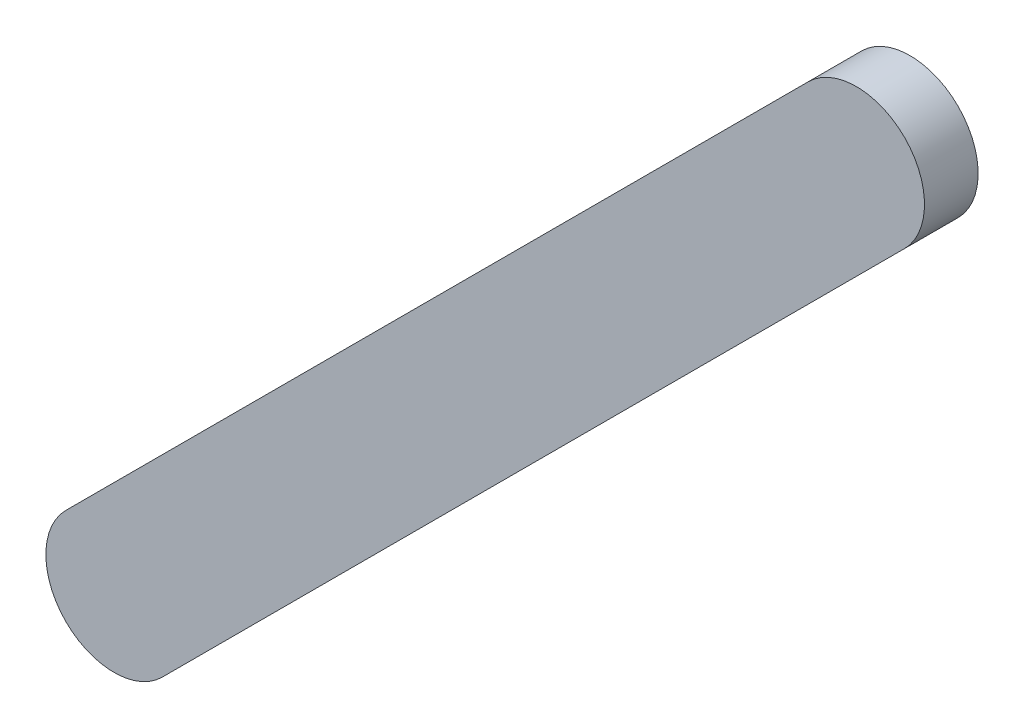
ISO-10303-21;
HEADER;
FILE_DESCRIPTION(('STEP AP214'),'2;1');
FILE_NAME('part.step','',(''),(''),'','','');
FILE_SCHEMA(('AUTOMOTIVE_DESIGN { 1 0 10303 214 1 1 1 1 }'));
ENDSEC;
DATA;
#1=APPLICATION_CONTEXT('core data for automotive mechanical design processes');
#2=APPLICATION_PROTOCOL_DEFINITION('international standard','automotive_design',2000,#1);
#3=PRODUCT_CONTEXT('',#1,'mechanical');
#4=PRODUCT('Part','Part','',(#3));
#5=PRODUCT_RELATED_PRODUCT_CATEGORY('part','',(#4));
#6=PRODUCT_DEFINITION_FORMATION('','',#4);
#7=PRODUCT_DEFINITION_CONTEXT('part definition',#1,'design');
#8=PRODUCT_DEFINITION('design','',#6,#7);
#9=PRODUCT_DEFINITION_SHAPE('','',#8);
#10=(LENGTH_UNIT() NAMED_UNIT(*) SI_UNIT(.MILLI.,.METRE.));
#11=(NAMED_UNIT(*) PLANE_ANGLE_UNIT() SI_UNIT($,.RADIAN.));
#12=(NAMED_UNIT(*) SI_UNIT($,.STERADIAN.) SOLID_ANGLE_UNIT());
#13=UNCERTAINTY_MEASURE_WITH_UNIT(LENGTH_MEASURE(1.E-05),#10,'distance_accuracy_value','');
#14=(GEOMETRIC_REPRESENTATION_CONTEXT(3) GLOBAL_UNCERTAINTY_ASSIGNED_CONTEXT((#13)) GLOBAL_UNIT_ASSIGNED_CONTEXT((#10,
#11,#12)) REPRESENTATION_CONTEXT('',''));
#15=CARTESIAN_POINT('',(0.,0.,0.));
#16=DIRECTION('',(0.,0.,1.));
#17=DIRECTION('',(1.,0.,0.));
#18=AXIS2_PLACEMENT_3D('',#15,#16,#17);
#19=CARTESIAN_POINT('',(133.65660594,119.8607966,0.));
#20=DIRECTION('',(-0.707106781186546,0.707106781186549,0.));
#21=DIRECTION('',(0.707106781186549,0.707106781186546,0.));
#22=AXIS2_PLACEMENT_3D('',#19,#20,#21);
#23=PLANE('',#22);
#24=DIRECTION('',(0.707106781186549,0.707106781186546,0.));
#25=VECTOR('',#24,1.);
#26=CARTESIAN_POINT('',(133.65660594,119.8607966,0.1999996));
#27=LINE('',#26,#25);
#28=CARTESIAN_POINT('',(133.65660594,119.8607966,0.1999996));
#29=VERTEX_POINT('',#28);
#30=CARTESIAN_POINT('',(136.4252034,122.62939406,0.1999996));
#31=VERTEX_POINT('',#30);
#32=EDGE_CURVE('E11',#29,#31,#27,.T.);
#33=ORIENTED_EDGE('',*,*,#32,.F.);
#34=DIRECTION('',(0.,0.,1.));
#35=VECTOR('',#34,1.);
#36=CARTESIAN_POINT('',(133.65660594,119.8607966,0.));
#37=LINE('',#36,#35);
#38=CARTESIAN_POINT('',(133.65660594,119.8607966,0.));
#39=VERTEX_POINT('',#38);
#40=EDGE_CURVE('E24',#39,#29,#37,.T.);
#41=ORIENTED_EDGE('',*,*,#40,.F.);
#42=DIRECTION('',(0.707106781186549,0.707106781186546,0.));
#43=VECTOR('',#42,1.);
#44=CARTESIAN_POINT('',(133.65660594,119.8607966,0.));
#45=LINE('',#44,#43);
#46=CARTESIAN_POINT('',(136.4252034,122.62939406,0.));
#47=VERTEX_POINT('',#46);
#48=EDGE_CURVE('E75',#39,#47,#45,.T.);
#49=ORIENTED_EDGE('',*,*,#48,.T.);
#50=DIRECTION('',(0.,0.,1.));
#51=VECTOR('',#50,1.);
#52=CARTESIAN_POINT('',(136.4252034,122.62939406,0.));
#53=LINE('',#52,#51);
#54=EDGE_CURVE('E37',#47,#31,#53,.T.);
#55=ORIENTED_EDGE('',*,*,#54,.T.);
#56=EDGE_LOOP('',(#33,#41,#49,#55));
#57=FACE_BOUND('',#56,.T.);
#58=ADVANCED_FACE('F17',(#57),#23,.F.);
#59=CARTESIAN_POINT('',(136.24559873,122.80899873,0.));
#60=DIRECTION('',(0.,0.,-1.));
#61=DIRECTION('',(0.707106781186548,-0.707106781186548,0.));
#62=AXIS2_PLACEMENT_3D('',#59,#60,#61);
#63=CYLINDRICAL_SURFACE('',#62,0.253999360179556);
#64=CARTESIAN_POINT('',(136.24559873,122.80899873,0.1999996));
#65=DIRECTION('',(0.,0.,1.));
#66=DIRECTION('',(0.707106781186548,-0.707106781186548,0.));
#67=AXIS2_PLACEMENT_3D('',#64,#65,#66);
#68=CIRCLE('',#67,0.253999360179556);
#69=CARTESIAN_POINT('',(136.06599406,122.9886034,0.1999996));
#70=VERTEX_POINT('',#69);
#71=EDGE_CURVE('E83',#31,#70,#68,.T.);
#72=ORIENTED_EDGE('',*,*,#71,.F.);
#73=ORIENTED_EDGE('',*,*,#54,.F.);
#74=CARTESIAN_POINT('',(136.24559873,122.80899873,0.));
#75=DIRECTION('',(0.,0.,1.));
#76=DIRECTION('',(0.707106781186548,-0.707106781186548,0.));
#77=AXIS2_PLACEMENT_3D('',#74,#75,#76);
#78=CIRCLE('',#77,0.253999360179556);
#79=CARTESIAN_POINT('',(136.06599406,122.9886034,0.));
#80=VERTEX_POINT('',#79);
#81=EDGE_CURVE('E81',#47,#80,#78,.T.);
#82=ORIENTED_EDGE('',*,*,#81,.T.);
#83=DIRECTION('',(0.,0.,1.));
#84=VECTOR('',#83,1.);
#85=CARTESIAN_POINT('',(136.06599406,122.9886034,0.));
#86=LINE('',#85,#84);
#87=EDGE_CURVE('E67',#80,#70,#86,.T.);
#88=ORIENTED_EDGE('',*,*,#87,.T.);
#89=EDGE_LOOP('',(#72,#73,#82,#88));
#90=FACE_BOUND('',#89,.T.);
#91=ADVANCED_FACE('F89',(#90),#63,.T.);
#92=CARTESIAN_POINT('',(136.06599406,122.9886034,0.));
#93=DIRECTION('',(0.707106781186553,-0.707106781186542,0.));
#94=DIRECTION('',(-0.707106781186542,-0.707106781186553,0.));
#95=AXIS2_PLACEMENT_3D('',#92,#93,#94);
#96=PLANE('',#95);
#97=DIRECTION('',(-0.707106781186542,-0.707106781186553,0.));
#98=VECTOR('',#97,1.);
#99=CARTESIAN_POINT('',(136.06599406,122.9886034,0.1999996));
#100=LINE('',#99,#98);
#101=CARTESIAN_POINT('',(133.2973966,120.22000594,0.1999996));
#102=VERTEX_POINT('',#101);
#103=EDGE_CURVE('E71',#70,#102,#100,.T.);
#104=ORIENTED_EDGE('',*,*,#103,.F.);
#105=ORIENTED_EDGE('',*,*,#87,.F.);
#106=DIRECTION('',(-0.707106781186542,-0.707106781186553,0.));
#107=VECTOR('',#106,1.);
#108=CARTESIAN_POINT('',(136.06599406,122.9886034,0.));
#109=LINE('',#108,#107);
#110=CARTESIAN_POINT('',(133.2973966,120.22000594,0.));
#111=VERTEX_POINT('',#110);
#112=EDGE_CURVE('E63',#80,#111,#109,.T.);
#113=ORIENTED_EDGE('',*,*,#112,.T.);
#114=DIRECTION('',(0.,0.,1.));
#115=VECTOR('',#114,1.);
#116=CARTESIAN_POINT('',(133.2973966,120.22000594,0.));
#117=LINE('',#116,#115);
#118=EDGE_CURVE('E53',#111,#102,#117,.T.);
#119=ORIENTED_EDGE('',*,*,#118,.T.);
#120=EDGE_LOOP('',(#104,#105,#113,#119));
#121=FACE_BOUND('',#120,.T.);
#122=ADVANCED_FACE('F66',(#121),#96,.F.);
#123=CARTESIAN_POINT('',(133.47700127,120.04040127,0.));
#124=DIRECTION('',(0.,0.,-1.));
#125=DIRECTION('',(-0.707106781186548,0.707106781186548,0.));
#126=AXIS2_PLACEMENT_3D('',#123,#124,#125);
#127=CYLINDRICAL_SURFACE('',#126,0.253999360179536);
#128=CARTESIAN_POINT('',(133.47700127,120.04040127,0.1999996));
#129=DIRECTION('',(0.,0.,1.));
#130=DIRECTION('',(-0.707106781186548,0.707106781186548,0.));
#131=AXIS2_PLACEMENT_3D('',#128,#129,#130);
#132=CIRCLE('',#131,0.253999360179536);
#133=EDGE_CURVE('E59',#102,#29,#132,.T.);
#134=ORIENTED_EDGE('',*,*,#133,.F.);
#135=ORIENTED_EDGE('',*,*,#118,.F.);
#136=CARTESIAN_POINT('',(133.47700127,120.04040127,0.));
#137=DIRECTION('',(0.,0.,1.));
#138=DIRECTION('',(-0.707106781186548,0.707106781186548,0.));
#139=AXIS2_PLACEMENT_3D('',#136,#137,#138);
#140=CIRCLE('',#139,0.253999360179536);
#141=EDGE_CURVE('E57',#111,#39,#140,.T.);
#142=ORIENTED_EDGE('',*,*,#141,.T.);
#143=ORIENTED_EDGE('',*,*,#40,.T.);
#144=EDGE_LOOP('',(#134,#135,#142,#143));
#145=FACE_BOUND('',#144,.T.);
#146=ADVANCED_FACE('F55',(#145),#127,.T.);
#147=CARTESIAN_POINT('',(133.65660594,119.8607966,0.));
#148=DIRECTION('',(0.,0.,-1.));
#149=DIRECTION('',(-1.,0.,0.));
#150=AXIS2_PLACEMENT_3D('',#147,#148,#149);
#151=PLANE('',#150);
#152=ORIENTED_EDGE('',*,*,#141,.F.);
#153=ORIENTED_EDGE('',*,*,#112,.F.);
#154=ORIENTED_EDGE('',*,*,#81,.F.);
#155=ORIENTED_EDGE('',*,*,#48,.F.);
#156=EDGE_LOOP('',(#152,#153,#154,#155));
#157=FACE_BOUND('',#156,.T.);
#158=ADVANCED_FACE('F74',(#157),#151,.T.);
#159=CARTESIAN_POINT('',(133.65660594,119.8607966,0.1999996));
#160=DIRECTION('',(0.,0.,-1.));
#161=DIRECTION('',(-1.,0.,0.));
#162=AXIS2_PLACEMENT_3D('',#159,#160,#161);
#163=PLANE('',#162);
#164=ORIENTED_EDGE('',*,*,#32,.T.);
#165=ORIENTED_EDGE('',*,*,#71,.T.);
#166=ORIENTED_EDGE('',*,*,#103,.T.);
#167=ORIENTED_EDGE('',*,*,#133,.T.);
#168=EDGE_LOOP('',(#164,#165,#166,#167));
#169=FACE_BOUND('',#168,.T.);
#170=ADVANCED_FACE('F91',(#169),#163,.F.);
#171=CLOSED_SHELL('',(#58,#91,#122,#146,#158,#170));
#172=MANIFOLD_SOLID_BREP('B1',#171);
#173=ADVANCED_BREP_SHAPE_REPRESENTATION('',(#18,#172),#14);
#174=SHAPE_DEFINITION_REPRESENTATION(#9,#173);
ENDSEC;
END-ISO-10303-21;
